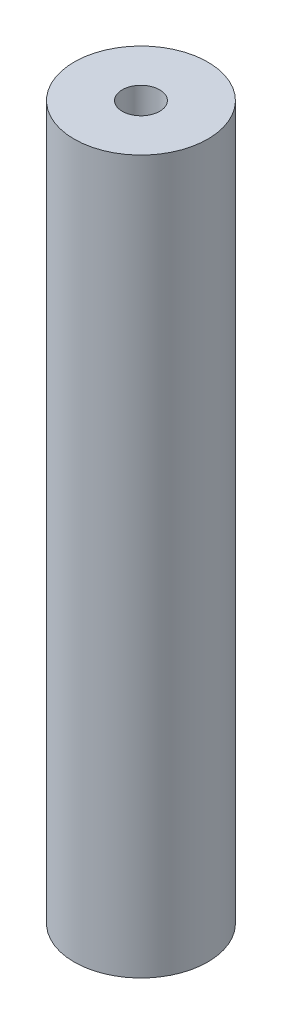
ISO-10303-21;
HEADER;
FILE_DESCRIPTION(('STEP AP214'),'2;1');
FILE_NAME('part.step','',(''),(''),'','','');
FILE_SCHEMA(('AUTOMOTIVE_DESIGN { 1 0 10303 214 1 1 1 1 }'));
ENDSEC;
DATA;
#1=APPLICATION_CONTEXT('core data for automotive mechanical design processes');
#2=APPLICATION_PROTOCOL_DEFINITION('international standard','automotive_design',2000,#1);
#3=PRODUCT_CONTEXT('',#1,'mechanical');
#4=PRODUCT('Part','Part','',(#3));
#5=PRODUCT_RELATED_PRODUCT_CATEGORY('part','',(#4));
#6=PRODUCT_DEFINITION_FORMATION('','',#4);
#7=PRODUCT_DEFINITION_CONTEXT('part definition',#1,'design');
#8=PRODUCT_DEFINITION('design','',#6,#7);
#9=PRODUCT_DEFINITION_SHAPE('','',#8);
#10=(LENGTH_UNIT() NAMED_UNIT(*) SI_UNIT(.MILLI.,.METRE.));
#11=(NAMED_UNIT(*) PLANE_ANGLE_UNIT() SI_UNIT($,.RADIAN.));
#12=(NAMED_UNIT(*) SI_UNIT($,.STERADIAN.) SOLID_ANGLE_UNIT());
#13=UNCERTAINTY_MEASURE_WITH_UNIT(LENGTH_MEASURE(1.E-05),#10,'distance_accuracy_value','');
#14=(GEOMETRIC_REPRESENTATION_CONTEXT(3) GLOBAL_UNCERTAINTY_ASSIGNED_CONTEXT((#13)) GLOBAL_UNIT_ASSIGNED_CONTEXT((#10,
#11,#12)) REPRESENTATION_CONTEXT('',''));
#15=CARTESIAN_POINT('',(0.,0.,0.));
#16=DIRECTION('',(0.,0.,1.));
#17=DIRECTION('',(1.,0.,0.));
#18=AXIS2_PLACEMENT_3D('',#15,#16,#17);
#19=CARTESIAN_POINT('',(0.,80.,0.));
#20=DIRECTION('',(0.,1.,0.));
#21=DIRECTION('',(0.,0.,1.));
#22=AXIS2_PLACEMENT_3D('',#19,#20,#21);
#23=PLANE('',#22);
#24=CARTESIAN_POINT('',(0.,80.,0.));
#25=DIRECTION('',(0.,1.,0.));
#26=DIRECTION('',(0.,0.,1.));
#27=AXIS2_PLACEMENT_3D('',#24,#25,#26);
#28=CIRCLE('',#27,7.5);
#29=CARTESIAN_POINT('',(0.,80.,7.5));
#30=VERTEX_POINT('',#29);
#31=EDGE_CURVE('E10',#30,#30,#28,.T.);
#32=ORIENTED_EDGE('',*,*,#31,.T.);
#33=EDGE_LOOP('',(#32));
#34=FACE_BOUND('',#33,.T.);
#35=CARTESIAN_POINT('',(0.,80.,0.));
#36=DIRECTION('',(0.,1.,0.));
#37=DIRECTION('',(0.,0.,1.));
#38=AXIS2_PLACEMENT_3D('',#35,#36,#37);
#39=CIRCLE('',#38,2.1);
#40=CARTESIAN_POINT('',(0.,80.,2.1));
#41=VERTEX_POINT('',#40);
#42=EDGE_CURVE('E42',#41,#41,#39,.T.);
#43=ORIENTED_EDGE('',*,*,#42,.F.);
#44=EDGE_LOOP('',(#43));
#45=FACE_BOUND('',#44,.T.);
#46=ADVANCED_FACE('F31',(#34,#45),#23,.T.);
#47=CARTESIAN_POINT('',(0.,0.,0.));
#48=DIRECTION('',(0.,1.,0.));
#49=DIRECTION('',(0.,0.,1.));
#50=AXIS2_PLACEMENT_3D('',#47,#48,#49);
#51=PLANE('',#50);
#52=CARTESIAN_POINT('',(0.,0.,0.));
#53=DIRECTION('',(0.,1.,0.));
#54=DIRECTION('',(0.,0.,1.));
#55=AXIS2_PLACEMENT_3D('',#52,#53,#54);
#56=CIRCLE('',#55,7.5);
#57=CARTESIAN_POINT('',(0.,0.,7.5));
#58=VERTEX_POINT('',#57);
#59=EDGE_CURVE('E35',#58,#58,#56,.T.);
#60=ORIENTED_EDGE('',*,*,#59,.F.);
#61=EDGE_LOOP('',(#60));
#62=FACE_BOUND('',#61,.T.);
#63=CARTESIAN_POINT('',(0.,0.,0.));
#64=DIRECTION('',(0.,1.,0.));
#65=DIRECTION('',(0.,0.,1.));
#66=AXIS2_PLACEMENT_3D('',#63,#64,#65);
#67=CIRCLE('',#66,2.1);
#68=CARTESIAN_POINT('',(0.,0.,2.1));
#69=VERTEX_POINT('',#68);
#70=EDGE_CURVE('E44',#69,#69,#67,.T.);
#71=ORIENTED_EDGE('',*,*,#70,.T.);
#72=EDGE_LOOP('',(#71));
#73=FACE_BOUND('',#72,.T.);
#74=ADVANCED_FACE('F54',(#62,#73),#51,.F.);
#75=CARTESIAN_POINT('',(0.,80.,0.));
#76=DIRECTION('',(0.,-1.,0.));
#77=DIRECTION('',(0.,0.,-1.));
#78=AXIS2_PLACEMENT_3D('',#75,#76,#77);
#79=CYLINDRICAL_SURFACE('',#78,7.5);
#80=ORIENTED_EDGE('',*,*,#31,.F.);
#81=EDGE_LOOP('',(#80));
#82=FACE_BOUND('',#81,.T.);
#83=ORIENTED_EDGE('',*,*,#59,.T.);
#84=EDGE_LOOP('',(#83));
#85=FACE_BOUND('',#84,.T.);
#86=ADVANCED_FACE('F33',(#82,#85),#79,.T.);
#87=CARTESIAN_POINT('',(0.,80.,0.));
#88=DIRECTION('',(0.,-1.,0.));
#89=DIRECTION('',(0.,0.,-1.));
#90=AXIS2_PLACEMENT_3D('',#87,#88,#89);
#91=CYLINDRICAL_SURFACE('',#90,2.1);
#92=ORIENTED_EDGE('',*,*,#42,.T.);
#93=EDGE_LOOP('',(#92));
#94=FACE_BOUND('',#93,.T.);
#95=ORIENTED_EDGE('',*,*,#70,.F.);
#96=EDGE_LOOP('',(#95));
#97=FACE_BOUND('',#96,.T.);
#98=ADVANCED_FACE('F50',(#94,#97),#91,.F.);
#99=CLOSED_SHELL('',(#46,#74,#86,#98));
#100=MANIFOLD_SOLID_BREP('B2',#99);
#101=ADVANCED_BREP_SHAPE_REPRESENTATION('',(#18,#100),#14);
#102=SHAPE_DEFINITION_REPRESENTATION(#9,#101);
ENDSEC;
END-ISO-10303-21;
